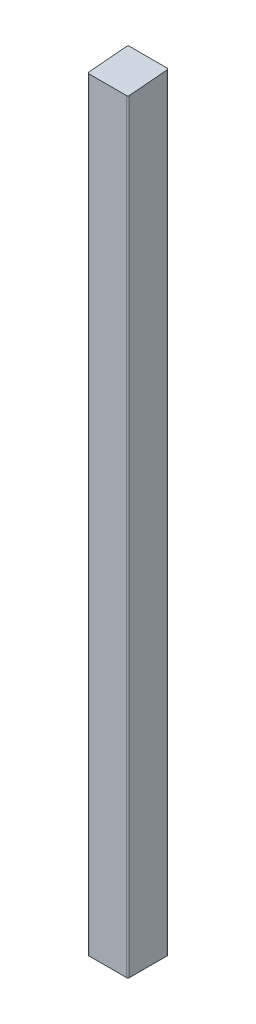
ISO-10303-21;
HEADER;
FILE_DESCRIPTION(('STEP AP214'),'2;1');
FILE_NAME('part.step','',(''),(''),'','','');
FILE_SCHEMA(('AUTOMOTIVE_DESIGN { 1 0 10303 214 1 1 1 1 }'));
ENDSEC;
DATA;
#1=APPLICATION_CONTEXT('core data for automotive mechanical design processes');
#2=APPLICATION_PROTOCOL_DEFINITION('international standard','automotive_design',2000,#1);
#3=PRODUCT_CONTEXT('',#1,'mechanical');
#4=PRODUCT('Part','Part','',(#3));
#5=PRODUCT_RELATED_PRODUCT_CATEGORY('part','',(#4));
#6=PRODUCT_DEFINITION_FORMATION('','',#4);
#7=PRODUCT_DEFINITION_CONTEXT('part definition',#1,'design');
#8=PRODUCT_DEFINITION('design','',#6,#7);
#9=PRODUCT_DEFINITION_SHAPE('','',#8);
#10=(LENGTH_UNIT() NAMED_UNIT(*) SI_UNIT(.MILLI.,.METRE.));
#11=(NAMED_UNIT(*) PLANE_ANGLE_UNIT() SI_UNIT($,.RADIAN.));
#12=(NAMED_UNIT(*) SI_UNIT($,.STERADIAN.) SOLID_ANGLE_UNIT());
#13=UNCERTAINTY_MEASURE_WITH_UNIT(LENGTH_MEASURE(1.E-05),#10,'distance_accuracy_value','');
#14=(GEOMETRIC_REPRESENTATION_CONTEXT(3) GLOBAL_UNCERTAINTY_ASSIGNED_CONTEXT((#13)) GLOBAL_UNIT_ASSIGNED_CONTEXT((#10,
#11,#12)) REPRESENTATION_CONTEXT('',''));
#15=CARTESIAN_POINT('',(0.,0.,0.));
#16=DIRECTION('',(0.,0.,1.));
#17=DIRECTION('',(1.,0.,0.));
#18=AXIS2_PLACEMENT_3D('',#15,#16,#17);
#19=CARTESIAN_POINT('',(44.45,0.,-88.9));
#20=DIRECTION('',(0.,1.,0.));
#21=DIRECTION('',(0.,0.,1.));
#22=AXIS2_PLACEMENT_3D('',#19,#20,#21);
#23=PLANE('',#22);
#24=DIRECTION('',(0.,0.,-1.));
#25=VECTOR('',#24,1.);
#26=CARTESIAN_POINT('',(-44.45,0.,-88.9));
#27=LINE('',#26,#25);
#28=CARTESIAN_POINT('',(-44.45,0.,-3.175));
#29=VERTEX_POINT('',#28);
#30=CARTESIAN_POINT('',(-44.45,0.,-85.725));
#31=VERTEX_POINT('',#30);
#32=EDGE_CURVE('E166',#29,#31,#27,.T.);
#33=ORIENTED_EDGE('',*,*,#32,.T.);
#34=CARTESIAN_POINT('',(-41.275,0.,-85.725));
#35=DIRECTION('',(0.,1.,0.));
#36=DIRECTION('',(0.,0.,1.));
#37=AXIS2_PLACEMENT_3D('',#34,#35,#36);
#38=CIRCLE('',#37,3.175);
#39=CARTESIAN_POINT('',(-41.275,0.,-88.9));
#40=VERTEX_POINT('',#39);
#41=EDGE_CURVE('E140',#31,#40,#38,.F.);
#42=ORIENTED_EDGE('',*,*,#41,.T.);
#43=DIRECTION('',(-1.,0.,0.));
#44=VECTOR('',#43,1.);
#45=CARTESIAN_POINT('',(44.45,0.,-88.9));
#46=LINE('',#45,#44);
#47=CARTESIAN_POINT('',(41.275,0.,-88.9));
#48=VERTEX_POINT('',#47);
#49=EDGE_CURVE('E119',#48,#40,#46,.T.);
#50=ORIENTED_EDGE('',*,*,#49,.F.);
#51=CARTESIAN_POINT('',(41.275,0.,-85.725));
#52=DIRECTION('',(0.,1.,0.));
#53=DIRECTION('',(0.,0.,1.));
#54=AXIS2_PLACEMENT_3D('',#51,#52,#53);
#55=CIRCLE('',#54,3.175);
#56=CARTESIAN_POINT('',(44.45,0.,-85.725));
#57=VERTEX_POINT('',#56);
#58=EDGE_CURVE('E124',#48,#57,#55,.F.);
#59=ORIENTED_EDGE('',*,*,#58,.T.);
#60=DIRECTION('',(0.,0.,-1.));
#61=VECTOR('',#60,1.);
#62=CARTESIAN_POINT('',(44.45,0.,-88.9));
#63=LINE('',#62,#61);
#64=CARTESIAN_POINT('',(44.45,0.,-3.175));
#65=VERTEX_POINT('',#64);
#66=EDGE_CURVE('E161',#65,#57,#63,.T.);
#67=ORIENTED_EDGE('',*,*,#66,.F.);
#68=CARTESIAN_POINT('',(41.275,0.,-3.175));
#69=DIRECTION('',(0.,1.,0.));
#70=DIRECTION('',(0.,0.,1.));
#71=AXIS2_PLACEMENT_3D('',#68,#69,#70);
#72=CIRCLE('',#71,3.175);
#73=CARTESIAN_POINT('',(41.275,0.,0.));
#74=VERTEX_POINT('',#73);
#75=EDGE_CURVE('E54',#65,#74,#72,.F.);
#76=ORIENTED_EDGE('',*,*,#75,.T.);
#77=DIRECTION('',(-1.,0.,0.));
#78=VECTOR('',#77,1.);
#79=CARTESIAN_POINT('',(44.45,0.,0.));
#80=LINE('',#79,#78);
#81=CARTESIAN_POINT('',(-41.275,0.,0.));
#82=VERTEX_POINT('',#81);
#83=EDGE_CURVE('E151',#74,#82,#80,.T.);
#84=ORIENTED_EDGE('',*,*,#83,.T.);
#85=CARTESIAN_POINT('',(-41.275,0.,-3.175));
#86=DIRECTION('',(0.,1.,0.));
#87=DIRECTION('',(0.,0.,1.));
#88=AXIS2_PLACEMENT_3D('',#85,#86,#87);
#89=CIRCLE('',#88,3.175);
#90=EDGE_CURVE('E47',#82,#29,#89,.F.);
#91=ORIENTED_EDGE('',*,*,#90,.T.);
#92=EDGE_LOOP('',(#33,#42,#50,#59,#67,#76,#84,#91));
#93=FACE_BOUND('',#92,.T.);
#94=ADVANCED_FACE('F32',(#93),#23,.F.);
#95=CARTESIAN_POINT('',(44.45,1681.00274218745,-88.8999999999998));
#96=DIRECTION('',(0.,0.,1.));
#97=DIRECTION('',(0.,-1.,0.));
#98=AXIS2_PLACEMENT_3D('',#95,#96,#97);
#99=PLANE('',#98);
#100=ORIENTED_EDGE('',*,*,#49,.T.);
#101=DIRECTION('',(0.,1.,0.));
#102=VECTOR('',#101,1.);
#103=CARTESIAN_POINT('',(-41.275,1681.00274218745,-88.8999999999998));
#104=LINE('',#103,#102);
#105=CARTESIAN_POINT('',(-41.275,1681.00274218745,-88.8999999999998));
#106=VERTEX_POINT('',#105);
#107=EDGE_CURVE('E118',#40,#106,#104,.T.);
#108=ORIENTED_EDGE('',*,*,#107,.T.);
#109=DIRECTION('',(-1.,0.,0.));
#110=VECTOR('',#109,1.);
#111=CARTESIAN_POINT('',(44.45,1681.00274218745,-88.8999999999998));
#112=LINE('',#111,#110);
#113=CARTESIAN_POINT('',(41.275,1681.00274218745,-88.8999999999998));
#114=VERTEX_POINT('',#113);
#115=EDGE_CURVE('E101',#114,#106,#112,.T.);
#116=ORIENTED_EDGE('',*,*,#115,.F.);
#117=DIRECTION('',(0.,1.,0.));
#118=VECTOR('',#117,1.);
#119=CARTESIAN_POINT('',(41.275,1681.00274218745,-88.8999999999998));
#120=LINE('',#119,#118);
#121=EDGE_CURVE('E115',#114,#48,#120,.F.);
#122=ORIENTED_EDGE('',*,*,#121,.T.);
#123=EDGE_LOOP('',(#100,#108,#116,#122));
#124=FACE_BOUND('',#123,.T.);
#125=ADVANCED_FACE('F114',(#124),#99,.F.);
#126=CARTESIAN_POINT('',(44.45,1673.225,0.));
#127=DIRECTION('',(0.,-0.996194698091745,-0.087155742747662));
#128=DIRECTION('',(0.,0.087155742747662,-0.996194698091745));
#129=AXIS2_PLACEMENT_3D('',#126,#127,#128);
#130=PLANE('',#129);
#131=ORIENTED_EDGE('',*,*,#115,.T.);
#132=CARTESIAN_POINT('',(-41.275,1680.72496568076,-85.7249999999998));
#133=DIRECTION('',(0.,-0.996194698091745,-0.087155742747662));
#134=DIRECTION('',(0.,-0.087155742747662,0.996194698091745));
#135=AXIS2_PLACEMENT_3D('',#132,#133,#134);
#136=ELLIPSE('',#135,3.18712798420013,3.175);
#137=CARTESIAN_POINT('',(-44.45,1680.72496568076,-85.7249999999998));
#138=VERTEX_POINT('',#137);
#139=EDGE_CURVE('E108',#106,#138,#136,.F.);
#140=ORIENTED_EDGE('',*,*,#139,.T.);
#141=DIRECTION('',(0.,-0.087155742747662,0.996194698091745));
#142=VECTOR('',#141,1.);
#143=CARTESIAN_POINT('',(-44.45,1673.225,0.));
#144=LINE('',#143,#142);
#145=CARTESIAN_POINT('',(-44.45,1673.50277650669,-3.175));
#146=VERTEX_POINT('',#145);
#147=EDGE_CURVE('E163',#138,#146,#144,.T.);
#148=ORIENTED_EDGE('',*,*,#147,.T.);
#149=CARTESIAN_POINT('',(-41.275,1673.50277650669,-3.175));
#150=DIRECTION('',(0.,-0.996194698091745,-0.087155742747662));
#151=DIRECTION('',(0.,0.087155742747662,-0.996194698091745));
#152=AXIS2_PLACEMENT_3D('',#149,#150,#151);
#153=ELLIPSE('',#152,3.18712798420013,3.175);
#154=CARTESIAN_POINT('',(-41.275,1673.225,0.));
#155=VERTEX_POINT('',#154);
#156=EDGE_CURVE('E109',#146,#155,#153,.F.);
#157=ORIENTED_EDGE('',*,*,#156,.T.);
#158=DIRECTION('',(-1.,0.,0.));
#159=VECTOR('',#158,1.);
#160=CARTESIAN_POINT('',(44.45,1673.225,0.));
#161=LINE('',#160,#159);
#162=CARTESIAN_POINT('',(41.275,1673.225,0.));
#163=VERTEX_POINT('',#162);
#164=EDGE_CURVE('E120',#163,#155,#161,.T.);
#165=ORIENTED_EDGE('',*,*,#164,.F.);
#166=CARTESIAN_POINT('',(41.275,1673.50277650669,-3.175));
#167=DIRECTION('',(0.,-0.996194698091745,-0.087155742747662));
#168=DIRECTION('',(0.,-0.087155742747662,0.996194698091745));
#169=AXIS2_PLACEMENT_3D('',#166,#167,#168);
#170=ELLIPSE('',#169,3.18712798420013,3.175);
#171=CARTESIAN_POINT('',(44.45,1673.50277650669,-3.175));
#172=VERTEX_POINT('',#171);
#173=EDGE_CURVE('E126',#163,#172,#170,.F.);
#174=ORIENTED_EDGE('',*,*,#173,.T.);
#175=DIRECTION('',(0.,-0.087155742747662,0.996194698091745));
#176=VECTOR('',#175,1.);
#177=CARTESIAN_POINT('',(44.45,1673.225,0.));
#178=LINE('',#177,#176);
#179=CARTESIAN_POINT('',(44.45,1680.72496568076,-85.7249999999998));
#180=VERTEX_POINT('',#179);
#181=EDGE_CURVE('E103',#180,#172,#178,.T.);
#182=ORIENTED_EDGE('',*,*,#181,.F.);
#183=CARTESIAN_POINT('',(41.275,1680.72496568076,-85.7249999999998));
#184=DIRECTION('',(0.,-0.996194698091745,-0.087155742747662));
#185=DIRECTION('',(0.,0.087155742747662,-0.996194698091745));
#186=AXIS2_PLACEMENT_3D('',#183,#184,#185);
#187=ELLIPSE('',#186,3.18712798420013,3.175);
#188=EDGE_CURVE('E98',#180,#114,#187,.F.);
#189=ORIENTED_EDGE('',*,*,#188,.T.);
#190=EDGE_LOOP('',(#131,#140,#148,#157,#165,#174,#182,#189));
#191=FACE_BOUND('',#190,.T.);
#192=ADVANCED_FACE('F100',(#191),#130,.F.);
#193=CARTESIAN_POINT('',(44.45,0.,0.));
#194=DIRECTION('',(0.,0.,-1.));
#195=DIRECTION('',(-1.,0.,0.));
#196=AXIS2_PLACEMENT_3D('',#193,#194,#195);
#197=PLANE('',#196);
#198=ORIENTED_EDGE('',*,*,#164,.T.);
#199=DIRECTION('',(0.,-1.,0.));
#200=VECTOR('',#199,1.);
#201=CARTESIAN_POINT('',(-41.275,0.,0.));
#202=LINE('',#201,#200);
#203=EDGE_CURVE('E11',#155,#82,#202,.T.);
#204=ORIENTED_EDGE('',*,*,#203,.T.);
#205=ORIENTED_EDGE('',*,*,#83,.F.);
#206=DIRECTION('',(0.,-1.,0.));
#207=VECTOR('',#206,1.);
#208=CARTESIAN_POINT('',(41.275,0.,0.));
#209=LINE('',#208,#207);
#210=EDGE_CURVE('E40',#74,#163,#209,.F.);
#211=ORIENTED_EDGE('',*,*,#210,.T.);
#212=EDGE_LOOP('',(#198,#204,#205,#211));
#213=FACE_BOUND('',#212,.T.);
#214=ADVANCED_FACE('F150',(#213),#197,.F.);
#215=CARTESIAN_POINT('',(44.45,0.,0.));
#216=DIRECTION('',(-1.,0.,0.));
#217=DIRECTION('',(0.,0.,1.));
#218=AXIS2_PLACEMENT_3D('',#215,#216,#217);
#219=PLANE('',#218);
#220=ORIENTED_EDGE('',*,*,#66,.T.);
#221=DIRECTION('',(0.,1.,0.));
#222=VECTOR('',#221,1.);
#223=CARTESIAN_POINT('',(44.45,0.,-85.725));
#224=LINE('',#223,#222);
#225=EDGE_CURVE('E145',#57,#180,#224,.T.);
#226=ORIENTED_EDGE('',*,*,#225,.T.);
#227=ORIENTED_EDGE('',*,*,#181,.T.);
#228=DIRECTION('',(0.,-1.,0.));
#229=VECTOR('',#228,1.);
#230=CARTESIAN_POINT('',(44.45,0.,-3.175));
#231=LINE('',#230,#229);
#232=EDGE_CURVE('E142',#172,#65,#231,.T.);
#233=ORIENTED_EDGE('',*,*,#232,.T.);
#234=EDGE_LOOP('',(#220,#226,#227,#233));
#235=FACE_BOUND('',#234,.T.);
#236=ADVANCED_FACE('F160',(#235),#219,.F.);
#237=CARTESIAN_POINT('',(-44.45,0.,0.));
#238=DIRECTION('',(-1.,0.,0.));
#239=DIRECTION('',(0.,0.,1.));
#240=AXIS2_PLACEMENT_3D('',#237,#238,#239);
#241=PLANE('',#240);
#242=ORIENTED_EDGE('',*,*,#147,.F.);
#243=DIRECTION('',(0.,1.,0.));
#244=VECTOR('',#243,1.);
#245=CARTESIAN_POINT('',(-44.45,0.,-85.725));
#246=LINE('',#245,#244);
#247=EDGE_CURVE('E135',#138,#31,#246,.F.);
#248=ORIENTED_EDGE('',*,*,#247,.T.);
#249=ORIENTED_EDGE('',*,*,#32,.F.);
#250=DIRECTION('',(0.,-1.,0.));
#251=VECTOR('',#250,1.);
#252=CARTESIAN_POINT('',(-44.45,1673.225,-3.175));
#253=LINE('',#252,#251);
#254=EDGE_CURVE('E133',#29,#146,#253,.F.);
#255=ORIENTED_EDGE('',*,*,#254,.T.);
#256=EDGE_LOOP('',(#242,#248,#249,#255));
#257=FACE_BOUND('',#256,.T.);
#258=ADVANCED_FACE('F174',(#257),#241,.T.);
#259=CARTESIAN_POINT('',(-41.275,1681.00274218745,-85.7249999999998));
#260=DIRECTION('',(0.,-1.,0.));
#261=DIRECTION('',(0.,0.,-1.));
#262=AXIS2_PLACEMENT_3D('',#259,#260,#261);
#263=CYLINDRICAL_SURFACE('',#262,3.175);
#264=ORIENTED_EDGE('',*,*,#41,.F.);
#265=ORIENTED_EDGE('',*,*,#247,.F.);
#266=ORIENTED_EDGE('',*,*,#139,.F.);
#267=ORIENTED_EDGE('',*,*,#107,.F.);
#268=EDGE_LOOP('',(#264,#265,#266,#267));
#269=FACE_BOUND('',#268,.T.);
#270=ADVANCED_FACE('F182',(#269),#263,.T.);
#271=CARTESIAN_POINT('',(41.275,0.,-85.725));
#272=DIRECTION('',(0.,1.,0.));
#273=DIRECTION('',(0.,0.,1.));
#274=AXIS2_PLACEMENT_3D('',#271,#272,#273);
#275=CYLINDRICAL_SURFACE('',#274,3.175);
#276=ORIENTED_EDGE('',*,*,#58,.F.);
#277=ORIENTED_EDGE('',*,*,#121,.F.);
#278=ORIENTED_EDGE('',*,*,#188,.F.);
#279=ORIENTED_EDGE('',*,*,#225,.F.);
#280=EDGE_LOOP('',(#276,#277,#278,#279));
#281=FACE_BOUND('',#280,.T.);
#282=ADVANCED_FACE('F123',(#281),#275,.T.);
#283=CARTESIAN_POINT('',(-41.275,0.,-3.175));
#284=DIRECTION('',(0.,1.,0.));
#285=DIRECTION('',(0.,0.,1.));
#286=AXIS2_PLACEMENT_3D('',#283,#284,#285);
#287=CYLINDRICAL_SURFACE('',#286,3.175);
#288=ORIENTED_EDGE('',*,*,#156,.F.);
#289=ORIENTED_EDGE('',*,*,#254,.F.);
#290=ORIENTED_EDGE('',*,*,#90,.F.);
#291=ORIENTED_EDGE('',*,*,#203,.F.);
#292=EDGE_LOOP('',(#288,#289,#290,#291));
#293=FACE_BOUND('',#292,.T.);
#294=ADVANCED_FACE('F176',(#293),#287,.T.);
#295=CARTESIAN_POINT('',(41.275,0.,-3.175));
#296=DIRECTION('',(0.,-1.,0.));
#297=DIRECTION('',(0.,0.,-1.));
#298=AXIS2_PLACEMENT_3D('',#295,#296,#297);
#299=CYLINDRICAL_SURFACE('',#298,3.175);
#300=ORIENTED_EDGE('',*,*,#173,.F.);
#301=ORIENTED_EDGE('',*,*,#210,.F.);
#302=ORIENTED_EDGE('',*,*,#75,.F.);
#303=ORIENTED_EDGE('',*,*,#232,.F.);
#304=EDGE_LOOP('',(#300,#301,#302,#303));
#305=FACE_BOUND('',#304,.T.);
#306=ADVANCED_FACE('F34',(#305),#299,.T.);
#307=CLOSED_SHELL('',(#94,#125,#192,#214,#236,#258,#270,#282,#294,#306));
#308=MANIFOLD_SOLID_BREP('B2',#307);
#309=ADVANCED_BREP_SHAPE_REPRESENTATION('',(#18,#308),#14);
#310=SHAPE_DEFINITION_REPRESENTATION(#9,#309);
ENDSEC;
END-ISO-10303-21;
